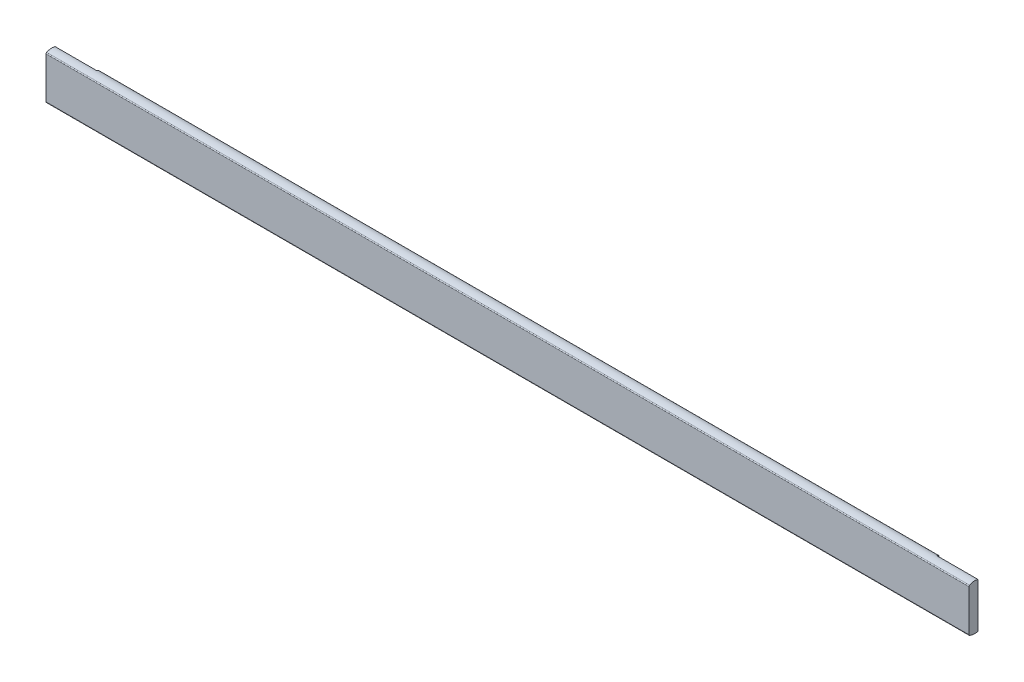
ISO-10303-21;
HEADER;
FILE_DESCRIPTION(('STEP AP214'),'2;1');
FILE_NAME('part.step','',(''),(''),'','','');
FILE_SCHEMA(('AUTOMOTIVE_DESIGN { 1 0 10303 214 1 1 1 1 }'));
ENDSEC;
DATA;
#1=APPLICATION_CONTEXT('core data for automotive mechanical design processes');
#2=APPLICATION_PROTOCOL_DEFINITION('international standard','automotive_design',2000,#1);
#3=PRODUCT_CONTEXT('',#1,'mechanical');
#4=PRODUCT('Part','Part','',(#3));
#5=PRODUCT_RELATED_PRODUCT_CATEGORY('part','',(#4));
#6=PRODUCT_DEFINITION_FORMATION('','',#4);
#7=PRODUCT_DEFINITION_CONTEXT('part definition',#1,'design');
#8=PRODUCT_DEFINITION('design','',#6,#7);
#9=PRODUCT_DEFINITION_SHAPE('','',#8);
#10=(LENGTH_UNIT() NAMED_UNIT(*) SI_UNIT(.MILLI.,.METRE.));
#11=(NAMED_UNIT(*) PLANE_ANGLE_UNIT() SI_UNIT($,.RADIAN.));
#12=(NAMED_UNIT(*) SI_UNIT($,.STERADIAN.) SOLID_ANGLE_UNIT());
#13=UNCERTAINTY_MEASURE_WITH_UNIT(LENGTH_MEASURE(1.E-05),#10,'distance_accuracy_value','');
#14=(GEOMETRIC_REPRESENTATION_CONTEXT(3) GLOBAL_UNCERTAINTY_ASSIGNED_CONTEXT((#13)) GLOBAL_UNIT_ASSIGNED_CONTEXT((#10,
#11,#12)) REPRESENTATION_CONTEXT('',''));
#15=CARTESIAN_POINT('',(0.,0.,0.));
#16=DIRECTION('',(0.,0.,1.));
#17=DIRECTION('',(1.,0.,0.));
#18=AXIS2_PLACEMENT_3D('',#15,#16,#17);
#19=CARTESIAN_POINT('',(1021.08,0.,12.7));
#20=DIRECTION('',(0.,0.,1.));
#21=DIRECTION('',(1.,0.,0.));
#22=AXIS2_PLACEMENT_3D('',#19,#20,#21);
#23=PLANE('',#22);
#24=DIRECTION('',(0.,1.,0.));
#25=VECTOR('',#24,1.);
#26=CARTESIAN_POINT('',(-1021.08,0.,12.7));
#27=LINE('',#26,#25);
#28=CARTESIAN_POINT('',(-1021.08,-45.8781346806783,12.7));
#29=VERTEX_POINT('',#28);
#30=CARTESIAN_POINT('',(-1021.08,45.8781346806783,12.7));
#31=VERTEX_POINT('',#30);
#32=EDGE_CURVE('E152',#29,#31,#27,.T.);
#33=ORIENTED_EDGE('',*,*,#32,.F.);
#34=DIRECTION('',(1.,0.,0.));
#35=VECTOR('',#34,1.);
#36=CARTESIAN_POINT('',(1021.08,-45.8781346806783,12.7));
#37=LINE('',#36,#35);
#38=CARTESIAN_POINT('',(1021.08,-45.8781346806783,12.7));
#39=VERTEX_POINT('',#38);
#40=EDGE_CURVE('E173',#29,#39,#37,.T.);
#41=ORIENTED_EDGE('',*,*,#40,.T.);
#42=DIRECTION('',(0.,1.,0.));
#43=VECTOR('',#42,1.);
#44=CARTESIAN_POINT('',(1021.08,0.,12.7));
#45=LINE('',#44,#43);
#46=CARTESIAN_POINT('',(1021.08,45.8781346806783,12.7));
#47=VERTEX_POINT('',#46);
#48=EDGE_CURVE('E154',#39,#47,#45,.T.);
#49=ORIENTED_EDGE('',*,*,#48,.T.);
#50=DIRECTION('',(-1.,0.,0.));
#51=VECTOR('',#50,1.);
#52=CARTESIAN_POINT('',(1021.08,45.8781346806783,12.7));
#53=LINE('',#52,#51);
#54=EDGE_CURVE('E170',#47,#31,#53,.T.);
#55=ORIENTED_EDGE('',*,*,#54,.T.);
#56=EDGE_LOOP('',(#33,#41,#49,#55));
#57=FACE_BOUND('',#56,.T.);
#58=ADVANCED_FACE('F37',(#57),#23,.T.);
#59=CARTESIAN_POINT('',(1021.08,-25.4,0.));
#60=DIRECTION('',(-1.,0.,0.));
#61=DIRECTION('',(0.,0.,1.));
#62=AXIS2_PLACEMENT_3D('',#59,#60,#61);
#63=CYLINDRICAL_SURFACE('',#62,25.4);
#64=CARTESIAN_POINT('',(929.64,-25.4,0.));
#65=DIRECTION('',(-1.,0.,0.));
#66=DIRECTION('',(0.,0.,1.));
#67=AXIS2_PLACEMENT_3D('',#64,#65,#66);
#68=CIRCLE('',#67,25.4);
#69=CARTESIAN_POINT('',(929.64,-48.1534829785314,-11.2888888888889));
#70=VERTEX_POINT('',#69);
#71=CARTESIAN_POINT('',(929.64,-49.6300557159904,-7.61999999999999));
#72=VERTEX_POINT('',#71);
#73=EDGE_CURVE('E213',#70,#72,#68,.T.);
#74=ORIENTED_EDGE('',*,*,#73,.T.);
#75=DIRECTION('',(-1.,0.,0.));
#76=VECTOR('',#75,1.);
#77=CARTESIAN_POINT('',(1021.08,-49.6300557159904,-7.62));
#78=LINE('',#77,#76);
#79=CARTESIAN_POINT('',(1021.08,-49.6300557159904,-7.62));
#80=VERTEX_POINT('',#79);
#81=EDGE_CURVE('E157',#72,#80,#78,.F.);
#82=ORIENTED_EDGE('',*,*,#81,.T.);
#83=CARTESIAN_POINT('',(1021.08,-25.4,0.));
#84=DIRECTION('',(1.,0.,0.));
#85=DIRECTION('',(0.,0.,-1.));
#86=AXIS2_PLACEMENT_3D('',#83,#84,#85);
#87=CIRCLE('',#86,25.4);
#88=CARTESIAN_POINT('',(1021.08,-48.1534829785315,11.2888888888889));
#89=VERTEX_POINT('',#88);
#90=EDGE_CURVE('E226',#89,#80,#87,.T.);
#91=ORIENTED_EDGE('',*,*,#90,.F.);
#92=DIRECTION('',(-1.,0.,0.));
#93=VECTOR('',#92,1.);
#94=CARTESIAN_POINT('',(1021.08,-48.1534829785315,11.2888888888889));
#95=LINE('',#94,#93);
#96=CARTESIAN_POINT('',(-1021.08,-48.1534829785315,11.2888888888889));
#97=VERTEX_POINT('',#96);
#98=EDGE_CURVE('E151',#89,#97,#95,.T.);
#99=ORIENTED_EDGE('',*,*,#98,.T.);
#100=CARTESIAN_POINT('',(-1021.08,-25.4,0.));
#101=DIRECTION('',(1.,0.,0.));
#102=DIRECTION('',(0.,0.,-1.));
#103=AXIS2_PLACEMENT_3D('',#100,#101,#102);
#104=CIRCLE('',#103,25.4);
#105=CARTESIAN_POINT('',(-1021.08,-49.6300557159904,-7.62));
#106=VERTEX_POINT('',#105);
#107=EDGE_CURVE('E142',#97,#106,#104,.T.);
#108=ORIENTED_EDGE('',*,*,#107,.T.);
#109=DIRECTION('',(-1.,0.,0.));
#110=VECTOR('',#109,1.);
#111=CARTESIAN_POINT('',(1021.08,-49.6300557159905,-7.61999999999975));
#112=LINE('',#111,#110);
#113=CARTESIAN_POINT('',(-929.64,-49.6300557159905,-7.61999999999999));
#114=VERTEX_POINT('',#113);
#115=EDGE_CURVE('E126',#106,#114,#112,.F.);
#116=ORIENTED_EDGE('',*,*,#115,.T.);
#117=CARTESIAN_POINT('',(-929.64,-25.4,0.));
#118=DIRECTION('',(1.,0.,0.));
#119=DIRECTION('',(0.,0.,-1.));
#120=AXIS2_PLACEMENT_3D('',#117,#118,#119);
#121=CIRCLE('',#120,25.4);
#122=CARTESIAN_POINT('',(-929.64,-48.1534829785314,-11.2888888888889));
#123=VERTEX_POINT('',#122);
#124=EDGE_CURVE('E211',#114,#123,#121,.T.);
#125=ORIENTED_EDGE('',*,*,#124,.T.);
#126=DIRECTION('',(-1.,0.,0.));
#127=VECTOR('',#126,1.);
#128=CARTESIAN_POINT('',(1021.08,-48.1534829785314,-11.2888888888889));
#129=LINE('',#128,#127);
#130=EDGE_CURVE('E161',#123,#70,#129,.F.);
#131=ORIENTED_EDGE('',*,*,#130,.T.);
#132=EDGE_LOOP('',(#74,#82,#91,#99,#108,#116,#125,#131));
#133=FACE_BOUND('',#132,.T.);
#134=ADVANCED_FACE('F148',(#133),#63,.T.);
#135=CARTESIAN_POINT('',(1021.08,0.,-12.7));
#136=DIRECTION('',(0.,0.,1.));
#137=DIRECTION('',(1.,0.,0.));
#138=AXIS2_PLACEMENT_3D('',#135,#136,#137);
#139=PLANE('',#138);
#140=DIRECTION('',(1.,0.,0.));
#141=VECTOR('',#140,1.);
#142=CARTESIAN_POINT('',(1021.08,45.8781346806783,-12.7));
#143=LINE('',#142,#141);
#144=CARTESIAN_POINT('',(-929.64,45.8781346806783,-12.7));
#145=VERTEX_POINT('',#144);
#146=CARTESIAN_POINT('',(929.64,45.8781346806783,-12.7));
#147=VERTEX_POINT('',#146);
#148=EDGE_CURVE('E179',#145,#147,#143,.T.);
#149=ORIENTED_EDGE('',*,*,#148,.T.);
#150=DIRECTION('',(0.,1.,0.));
#151=VECTOR('',#150,1.);
#152=CARTESIAN_POINT('',(929.64,-50.8,-12.7));
#153=LINE('',#152,#151);
#154=CARTESIAN_POINT('',(929.64,-45.8781346806783,-12.7));
#155=VERTEX_POINT('',#154);
#156=EDGE_CURVE('E59',#155,#147,#153,.T.);
#157=ORIENTED_EDGE('',*,*,#156,.F.);
#158=DIRECTION('',(-1.,0.,0.));
#159=VECTOR('',#158,1.);
#160=CARTESIAN_POINT('',(1021.08,-45.8781346806783,-12.7));
#161=LINE('',#160,#159);
#162=CARTESIAN_POINT('',(-929.64,-45.8781346806783,-12.7));
#163=VERTEX_POINT('',#162);
#164=EDGE_CURVE('E182',#155,#163,#161,.T.);
#165=ORIENTED_EDGE('',*,*,#164,.T.);
#166=DIRECTION('',(0.,1.,0.));
#167=VECTOR('',#166,1.);
#168=CARTESIAN_POINT('',(-929.64,-50.8,-12.7));
#169=LINE('',#168,#167);
#170=EDGE_CURVE('E191',#163,#145,#169,.T.);
#171=ORIENTED_EDGE('',*,*,#170,.T.);
#172=EDGE_LOOP('',(#149,#157,#165,#171));
#173=FACE_BOUND('',#172,.T.);
#174=ADVANCED_FACE('F197',(#173),#139,.F.);
#175=CARTESIAN_POINT('',(1021.08,25.4,0.));
#176=DIRECTION('',(-1.,0.,0.));
#177=DIRECTION('',(0.,0.,1.));
#178=AXIS2_PLACEMENT_3D('',#175,#176,#177);
#179=CYLINDRICAL_SURFACE('',#178,25.4);
#180=DIRECTION('',(-1.,0.,0.));
#181=VECTOR('',#180,1.);
#182=CARTESIAN_POINT('',(1021.08,49.6300557159904,-7.62));
#183=LINE('',#182,#181);
#184=CARTESIAN_POINT('',(929.64,49.6300557159904,-7.61999999999999));
#185=VERTEX_POINT('',#184);
#186=CARTESIAN_POINT('',(1021.08,49.6300557159904,-7.62));
#187=VERTEX_POINT('',#186);
#188=EDGE_CURVE('E135',#185,#187,#183,.F.);
#189=ORIENTED_EDGE('',*,*,#188,.F.);
#190=CARTESIAN_POINT('',(929.64,25.4,0.));
#191=DIRECTION('',(-1.,0.,0.));
#192=DIRECTION('',(0.,0.,1.));
#193=AXIS2_PLACEMENT_3D('',#190,#191,#192);
#194=CIRCLE('',#193,25.4);
#195=CARTESIAN_POINT('',(929.64,48.1534829785315,-11.2888888888889));
#196=VERTEX_POINT('',#195);
#197=EDGE_CURVE('E204',#196,#185,#194,.F.);
#198=ORIENTED_EDGE('',*,*,#197,.F.);
#199=DIRECTION('',(-1.,0.,0.));
#200=VECTOR('',#199,1.);
#201=CARTESIAN_POINT('',(1021.08,48.1534829785315,-11.2888888888889));
#202=LINE('',#201,#200);
#203=CARTESIAN_POINT('',(-929.64,48.1534829785315,-11.2888888888889));
#204=VERTEX_POINT('',#203);
#205=EDGE_CURVE('E187',#196,#204,#202,.T.);
#206=ORIENTED_EDGE('',*,*,#205,.T.);
#207=CARTESIAN_POINT('',(-929.64,25.4,0.));
#208=DIRECTION('',(1.,0.,0.));
#209=DIRECTION('',(0.,0.,-1.));
#210=AXIS2_PLACEMENT_3D('',#207,#208,#209);
#211=CIRCLE('',#210,25.4);
#212=CARTESIAN_POINT('',(-929.64,49.6300557159905,-7.61999999999999));
#213=VERTEX_POINT('',#212);
#214=EDGE_CURVE('E52',#213,#204,#211,.F.);
#215=ORIENTED_EDGE('',*,*,#214,.F.);
#216=DIRECTION('',(-1.,0.,0.));
#217=VECTOR('',#216,1.);
#218=CARTESIAN_POINT('',(1021.08,49.6300557159905,-7.61999999999975));
#219=LINE('',#218,#217);
#220=CARTESIAN_POINT('',(-1021.08,49.6300557159904,-7.62));
#221=VERTEX_POINT('',#220);
#222=EDGE_CURVE('E136',#221,#213,#219,.F.);
#223=ORIENTED_EDGE('',*,*,#222,.F.);
#224=CARTESIAN_POINT('',(-1021.08,25.4,0.));
#225=DIRECTION('',(1.,0.,0.));
#226=DIRECTION('',(0.,0.,-1.));
#227=AXIS2_PLACEMENT_3D('',#224,#225,#226);
#228=CIRCLE('',#227,25.4);
#229=CARTESIAN_POINT('',(-1021.08,48.1534829785315,11.2888888888889));
#230=VERTEX_POINT('',#229);
#231=EDGE_CURVE('E144',#230,#221,#228,.F.);
#232=ORIENTED_EDGE('',*,*,#231,.F.);
#233=DIRECTION('',(-1.,0.,0.));
#234=VECTOR('',#233,1.);
#235=CARTESIAN_POINT('',(1021.08,48.1534829785315,11.2888888888889));
#236=LINE('',#235,#234);
#237=CARTESIAN_POINT('',(1021.08,48.1534829785315,11.2888888888889));
#238=VERTEX_POINT('',#237);
#239=EDGE_CURVE('E185',#230,#238,#236,.F.);
#240=ORIENTED_EDGE('',*,*,#239,.T.);
#241=CARTESIAN_POINT('',(1021.08,25.4,0.));
#242=DIRECTION('',(1.,0.,0.));
#243=DIRECTION('',(0.,0.,-1.));
#244=AXIS2_PLACEMENT_3D('',#241,#242,#243);
#245=CIRCLE('',#244,25.4);
#246=EDGE_CURVE('E164',#238,#187,#245,.F.);
#247=ORIENTED_EDGE('',*,*,#246,.T.);
#248=EDGE_LOOP('',(#189,#198,#206,#215,#223,#232,#240,#247));
#249=FACE_BOUND('',#248,.T.);
#250=ADVANCED_FACE('F208',(#249),#179,.T.);
#251=CARTESIAN_POINT('',(1021.08,0.,0.));
#252=DIRECTION('',(1.,0.,0.));
#253=DIRECTION('',(0.,0.,-1.));
#254=AXIS2_PLACEMENT_3D('',#251,#252,#253);
#255=PLANE('',#254);
#256=DIRECTION('',(0.,1.,0.));
#257=VECTOR('',#256,1.);
#258=CARTESIAN_POINT('',(1021.08,-50.8,-7.62));
#259=LINE('',#258,#257);
#260=EDGE_CURVE('E235',#80,#187,#259,.T.);
#261=ORIENTED_EDGE('',*,*,#260,.T.);
#262=ORIENTED_EDGE('',*,*,#246,.F.);
#263=CARTESIAN_POINT('',(1021.08,45.8781346806783,10.16));
#264=DIRECTION('',(1.,0.,0.));
#265=DIRECTION('',(0.,0.,-1.));
#266=AXIS2_PLACEMENT_3D('',#263,#264,#265);
#267=CIRCLE('',#266,2.54);
#268=EDGE_CURVE('E175',#238,#47,#267,.T.);
#269=ORIENTED_EDGE('',*,*,#268,.T.);
#270=ORIENTED_EDGE('',*,*,#48,.F.);
#271=CARTESIAN_POINT('',(1021.08,-45.8781346806783,10.16));
#272=DIRECTION('',(1.,0.,0.));
#273=DIRECTION('',(0.,0.,-1.));
#274=AXIS2_PLACEMENT_3D('',#271,#272,#273);
#275=CIRCLE('',#274,2.54);
#276=EDGE_CURVE('E177',#39,#89,#275,.T.);
#277=ORIENTED_EDGE('',*,*,#276,.T.);
#278=ORIENTED_EDGE('',*,*,#90,.T.);
#279=EDGE_LOOP('',(#261,#262,#269,#270,#277,#278));
#280=FACE_BOUND('',#279,.T.);
#281=ADVANCED_FACE('F233',(#280),#255,.T.);
#282=CARTESIAN_POINT('',(-1021.08,0.,0.));
#283=DIRECTION('',(1.,0.,0.));
#284=DIRECTION('',(0.,0.,-1.));
#285=AXIS2_PLACEMENT_3D('',#282,#283,#284);
#286=PLANE('',#285);
#287=ORIENTED_EDGE('',*,*,#231,.T.);
#288=DIRECTION('',(0.,1.,0.));
#289=VECTOR('',#288,1.);
#290=CARTESIAN_POINT('',(-1021.08,-50.8,-7.62));
#291=LINE('',#290,#289);
#292=EDGE_CURVE('E129',#106,#221,#291,.T.);
#293=ORIENTED_EDGE('',*,*,#292,.F.);
#294=ORIENTED_EDGE('',*,*,#107,.F.);
#295=CARTESIAN_POINT('',(-1021.08,-45.8781346806783,10.16));
#296=DIRECTION('',(1.,0.,0.));
#297=DIRECTION('',(0.,0.,-1.));
#298=AXIS2_PLACEMENT_3D('',#295,#296,#297);
#299=CIRCLE('',#298,2.54);
#300=EDGE_CURVE('E168',#97,#29,#299,.F.);
#301=ORIENTED_EDGE('',*,*,#300,.T.);
#302=ORIENTED_EDGE('',*,*,#32,.T.);
#303=CARTESIAN_POINT('',(-1021.08,45.8781346806783,10.16));
#304=DIRECTION('',(1.,0.,0.));
#305=DIRECTION('',(0.,0.,-1.));
#306=AXIS2_PLACEMENT_3D('',#303,#304,#305);
#307=CIRCLE('',#306,2.54);
#308=EDGE_CURVE('E166',#31,#230,#307,.F.);
#309=ORIENTED_EDGE('',*,*,#308,.T.);
#310=EDGE_LOOP('',(#287,#293,#294,#301,#302,#309));
#311=FACE_BOUND('',#310,.T.);
#312=ADVANCED_FACE('F141',(#311),#286,.F.);
#313=CARTESIAN_POINT('',(1021.08,-45.8781346806783,10.16));
#314=DIRECTION('',(-1.,0.,0.));
#315=DIRECTION('',(0.,0.,1.));
#316=AXIS2_PLACEMENT_3D('',#313,#314,#315);
#317=CYLINDRICAL_SURFACE('',#316,2.54);
#318=ORIENTED_EDGE('',*,*,#276,.F.);
#319=ORIENTED_EDGE('',*,*,#40,.F.);
#320=ORIENTED_EDGE('',*,*,#300,.F.);
#321=ORIENTED_EDGE('',*,*,#98,.F.);
#322=EDGE_LOOP('',(#318,#319,#320,#321));
#323=FACE_BOUND('',#322,.T.);
#324=ADVANCED_FACE('F243',(#323),#317,.T.);
#325=CARTESIAN_POINT('',(1021.08,-45.8781346806783,-10.16));
#326=DIRECTION('',(-1.,0.,0.));
#327=DIRECTION('',(0.,0.,1.));
#328=AXIS2_PLACEMENT_3D('',#325,#326,#327);
#329=CYLINDRICAL_SURFACE('',#328,2.54);
#330=CARTESIAN_POINT('',(929.64,-45.8781346806783,-10.16));
#331=DIRECTION('',(-1.,0.,0.));
#332=DIRECTION('',(0.,0.,1.));
#333=AXIS2_PLACEMENT_3D('',#330,#331,#332);
#334=CIRCLE('',#333,2.54);
#335=EDGE_CURVE('E210',#70,#155,#334,.F.);
#336=ORIENTED_EDGE('',*,*,#335,.F.);
#337=ORIENTED_EDGE('',*,*,#130,.F.);
#338=CARTESIAN_POINT('',(-929.64,-45.8781346806783,-10.16));
#339=DIRECTION('',(1.,0.,0.));
#340=DIRECTION('',(0.,0.,-1.));
#341=AXIS2_PLACEMENT_3D('',#338,#339,#340);
#342=CIRCLE('',#341,2.54);
#343=EDGE_CURVE('E215',#163,#123,#342,.F.);
#344=ORIENTED_EDGE('',*,*,#343,.F.);
#345=ORIENTED_EDGE('',*,*,#164,.F.);
#346=EDGE_LOOP('',(#336,#337,#344,#345));
#347=FACE_BOUND('',#346,.T.);
#348=ADVANCED_FACE('F255',(#347),#329,.T.);
#349=CARTESIAN_POINT('',(1021.08,45.8781346806783,-10.16));
#350=DIRECTION('',(-1.,0.,0.));
#351=DIRECTION('',(0.,0.,1.));
#352=AXIS2_PLACEMENT_3D('',#349,#350,#351);
#353=CYLINDRICAL_SURFACE('',#352,2.54);
#354=CARTESIAN_POINT('',(929.64,45.8781346806783,-10.16));
#355=DIRECTION('',(-1.,0.,0.));
#356=DIRECTION('',(0.,0.,1.));
#357=AXIS2_PLACEMENT_3D('',#354,#355,#356);
#358=CIRCLE('',#357,2.54);
#359=EDGE_CURVE('E11',#147,#196,#358,.F.);
#360=ORIENTED_EDGE('',*,*,#359,.F.);
#361=ORIENTED_EDGE('',*,*,#148,.F.);
#362=CARTESIAN_POINT('',(-929.64,45.8781346806783,-10.16));
#363=DIRECTION('',(1.,0.,0.));
#364=DIRECTION('',(0.,0.,-1.));
#365=AXIS2_PLACEMENT_3D('',#362,#363,#364);
#366=CIRCLE('',#365,2.54);
#367=EDGE_CURVE('E45',#204,#145,#366,.F.);
#368=ORIENTED_EDGE('',*,*,#367,.F.);
#369=ORIENTED_EDGE('',*,*,#205,.F.);
#370=EDGE_LOOP('',(#360,#361,#368,#369));
#371=FACE_BOUND('',#370,.T.);
#372=ADVANCED_FACE('F200',(#371),#353,.T.);
#373=CARTESIAN_POINT('',(1021.08,45.8781346806783,10.16));
#374=DIRECTION('',(-1.,0.,0.));
#375=DIRECTION('',(0.,0.,1.));
#376=AXIS2_PLACEMENT_3D('',#373,#374,#375);
#377=CYLINDRICAL_SURFACE('',#376,2.54);
#378=ORIENTED_EDGE('',*,*,#268,.F.);
#379=ORIENTED_EDGE('',*,*,#239,.F.);
#380=ORIENTED_EDGE('',*,*,#308,.F.);
#381=ORIENTED_EDGE('',*,*,#54,.F.);
#382=EDGE_LOOP('',(#378,#379,#380,#381));
#383=FACE_BOUND('',#382,.T.);
#384=ADVANCED_FACE('F39',(#383),#377,.T.);
#385=CARTESIAN_POINT('',(-1021.08,-50.8,-7.62));
#386=DIRECTION('',(0.,0.,1.));
#387=DIRECTION('',(1.,0.,0.));
#388=AXIS2_PLACEMENT_3D('',#385,#386,#387);
#389=PLANE('',#388);
#390=ORIENTED_EDGE('',*,*,#292,.T.);
#391=ORIENTED_EDGE('',*,*,#222,.T.);
#392=DIRECTION('',(0.,1.,0.));
#393=VECTOR('',#392,1.);
#394=CARTESIAN_POINT('',(-929.64,-50.8,-7.61999999999999));
#395=LINE('',#394,#393);
#396=EDGE_CURVE('E131',#114,#213,#395,.T.);
#397=ORIENTED_EDGE('',*,*,#396,.F.);
#398=ORIENTED_EDGE('',*,*,#115,.F.);
#399=EDGE_LOOP('',(#390,#391,#397,#398));
#400=FACE_BOUND('',#399,.T.);
#401=ADVANCED_FACE('F128',(#400),#389,.F.);
#402=CARTESIAN_POINT('',(-929.64,-50.8,-12.7));
#403=DIRECTION('',(1.,0.,0.));
#404=DIRECTION('',(0.,0.,-1.));
#405=AXIS2_PLACEMENT_3D('',#402,#403,#404);
#406=PLANE('',#405);
#407=ORIENTED_EDGE('',*,*,#396,.T.);
#408=ORIENTED_EDGE('',*,*,#214,.T.);
#409=ORIENTED_EDGE('',*,*,#367,.T.);
#410=ORIENTED_EDGE('',*,*,#170,.F.);
#411=ORIENTED_EDGE('',*,*,#343,.T.);
#412=ORIENTED_EDGE('',*,*,#124,.F.);
#413=EDGE_LOOP('',(#407,#408,#409,#410,#411,#412));
#414=FACE_BOUND('',#413,.T.);
#415=ADVANCED_FACE('F190',(#414),#406,.F.);
#416=CARTESIAN_POINT('',(1021.08,-50.8,-7.62));
#417=DIRECTION('',(0.,0.,1.));
#418=DIRECTION('',(1.,0.,0.));
#419=AXIS2_PLACEMENT_3D('',#416,#417,#418);
#420=PLANE('',#419);
#421=DIRECTION('',(0.,1.,0.));
#422=VECTOR('',#421,1.);
#423=CARTESIAN_POINT('',(929.64,-50.8,-7.61999999999999));
#424=LINE('',#423,#422);
#425=EDGE_CURVE('E246',#72,#185,#424,.T.);
#426=ORIENTED_EDGE('',*,*,#425,.T.);
#427=ORIENTED_EDGE('',*,*,#188,.T.);
#428=ORIENTED_EDGE('',*,*,#260,.F.);
#429=ORIENTED_EDGE('',*,*,#81,.F.);
#430=EDGE_LOOP('',(#426,#427,#428,#429));
#431=FACE_BOUND('',#430,.T.);
#432=ADVANCED_FACE('F245',(#431),#420,.F.);
#433=CARTESIAN_POINT('',(929.64,-50.8,-12.7));
#434=DIRECTION('',(-1.,0.,0.));
#435=DIRECTION('',(0.,0.,1.));
#436=AXIS2_PLACEMENT_3D('',#433,#434,#435);
#437=PLANE('',#436);
#438=ORIENTED_EDGE('',*,*,#335,.T.);
#439=ORIENTED_EDGE('',*,*,#156,.T.);
#440=ORIENTED_EDGE('',*,*,#359,.T.);
#441=ORIENTED_EDGE('',*,*,#197,.T.);
#442=ORIENTED_EDGE('',*,*,#425,.F.);
#443=ORIENTED_EDGE('',*,*,#73,.F.);
#444=EDGE_LOOP('',(#438,#439,#440,#441,#442,#443));
#445=FACE_BOUND('',#444,.T.);
#446=ADVANCED_FACE('F202',(#445),#437,.F.);
#447=CLOSED_SHELL('',(#58,#134,#174,#250,#281,#312,#324,#348,#372,#384,#401,#415,#432,#446));
#448=MANIFOLD_SOLID_BREP('B2',#447);
#449=ADVANCED_BREP_SHAPE_REPRESENTATION('',(#18,#448),#14);
#450=SHAPE_DEFINITION_REPRESENTATION(#9,#449);
ENDSEC;
END-ISO-10303-21;
